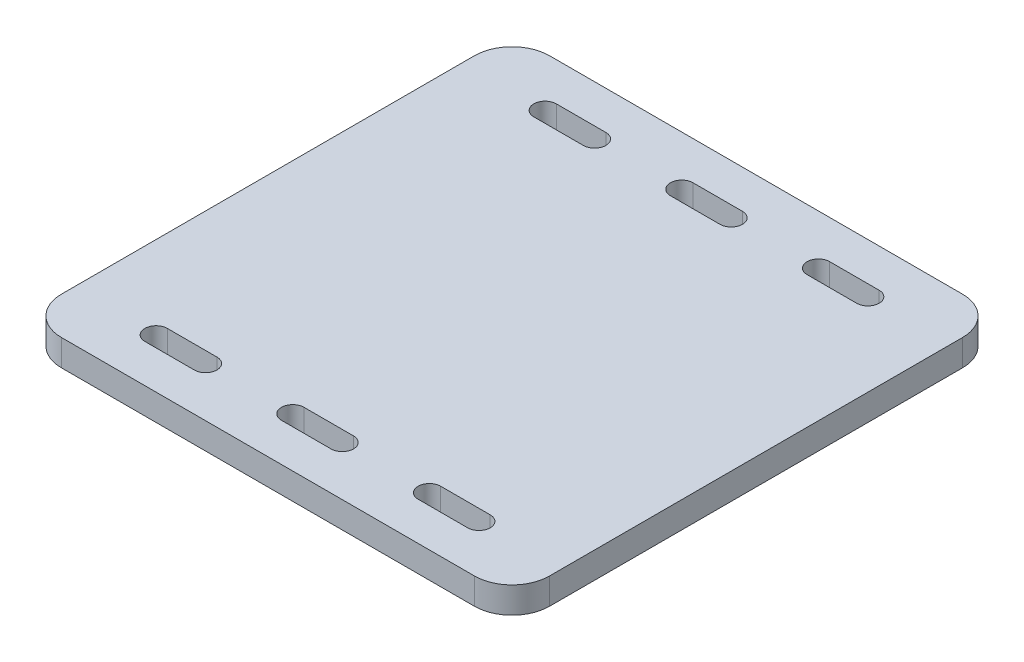
ISO-10303-21;
HEADER;
FILE_DESCRIPTION(('STEP AP214'),'2;1');
FILE_NAME('part.step','',(''),(''),'','','');
FILE_SCHEMA(('AUTOMOTIVE_DESIGN { 1 0 10303 214 1 1 1 1 }'));
ENDSEC;
DATA;
#1=APPLICATION_CONTEXT('core data for automotive mechanical design processes');
#2=APPLICATION_PROTOCOL_DEFINITION('international standard','automotive_design',2000,#1);
#3=PRODUCT_CONTEXT('',#1,'mechanical');
#4=PRODUCT('Part','Part','',(#3));
#5=PRODUCT_RELATED_PRODUCT_CATEGORY('part','',(#4));
#6=PRODUCT_DEFINITION_FORMATION('','',#4);
#7=PRODUCT_DEFINITION_CONTEXT('part definition',#1,'design');
#8=PRODUCT_DEFINITION('design','',#6,#7);
#9=PRODUCT_DEFINITION_SHAPE('','',#8);
#10=(LENGTH_UNIT() NAMED_UNIT(*) SI_UNIT(.MILLI.,.METRE.));
#11=(NAMED_UNIT(*) PLANE_ANGLE_UNIT() SI_UNIT($,.RADIAN.));
#12=(NAMED_UNIT(*) SI_UNIT($,.STERADIAN.) SOLID_ANGLE_UNIT());
#13=UNCERTAINTY_MEASURE_WITH_UNIT(LENGTH_MEASURE(1.E-05),#10,'distance_accuracy_value','');
#14=(GEOMETRIC_REPRESENTATION_CONTEXT(3) GLOBAL_UNCERTAINTY_ASSIGNED_CONTEXT((#13)) GLOBAL_UNIT_ASSIGNED_CONTEXT((#10,
#11,#12)) REPRESENTATION_CONTEXT('',''));
#15=CARTESIAN_POINT('',(0.,0.,0.));
#16=DIRECTION('',(0.,0.,1.));
#17=DIRECTION('',(1.,0.,0.));
#18=AXIS2_PLACEMENT_3D('',#15,#16,#17);
#19=CARTESIAN_POINT('',(-27.5,3.5,-27.5));
#20=DIRECTION('',(0.,1.,0.));
#21=DIRECTION('',(0.,0.,1.));
#22=AXIS2_PLACEMENT_3D('',#19,#20,#21);
#23=PLANE('',#22);
#24=CARTESIAN_POINT('',(-27.5,3.5,-27.5));
#25=DIRECTION('',(0.,1.,0.));
#26=DIRECTION('',(0.,0.,1.));
#27=AXIS2_PLACEMENT_3D('',#24,#25,#26);
#28=CIRCLE('',#27,5.);
#29=CARTESIAN_POINT('',(-27.5,3.5,-32.5));
#30=VERTEX_POINT('',#29);
#31=CARTESIAN_POINT('',(-32.5,3.5,-27.5));
#32=VERTEX_POINT('',#31);
#33=EDGE_CURVE('E517',#30,#32,#28,.T.);
#34=ORIENTED_EDGE('',*,*,#33,.T.);
#35=DIRECTION('',(0.,0.,1.));
#36=VECTOR('',#35,1.);
#37=CARTESIAN_POINT('',(-32.5,3.5,-27.5));
#38=LINE('',#37,#36);
#39=CARTESIAN_POINT('',(-32.5,3.5,27.5));
#40=VERTEX_POINT('',#39);
#41=EDGE_CURVE('E521',#32,#40,#38,.T.);
#42=ORIENTED_EDGE('',*,*,#41,.T.);
#43=CARTESIAN_POINT('',(-27.5,3.5,27.5));
#44=DIRECTION('',(0.,1.,0.));
#45=DIRECTION('',(0.,0.,1.));
#46=AXIS2_PLACEMENT_3D('',#43,#44,#45);
#47=CIRCLE('',#46,5.);
#48=CARTESIAN_POINT('',(-27.5,3.5,32.5));
#49=VERTEX_POINT('',#48);
#50=EDGE_CURVE('E525',#40,#49,#47,.T.);
#51=ORIENTED_EDGE('',*,*,#50,.T.);
#52=DIRECTION('',(1.,0.,0.));
#53=VECTOR('',#52,1.);
#54=CARTESIAN_POINT('',(-27.5,3.5,32.5));
#55=LINE('',#54,#53);
#56=CARTESIAN_POINT('',(27.5,3.5,32.5));
#57=VERTEX_POINT('',#56);
#58=EDGE_CURVE('E528',#49,#57,#55,.T.);
#59=ORIENTED_EDGE('',*,*,#58,.T.);
#60=CARTESIAN_POINT('',(27.5,3.5,27.5));
#61=DIRECTION('',(0.,1.,0.));
#62=DIRECTION('',(0.,0.,1.));
#63=AXIS2_PLACEMENT_3D('',#60,#61,#62);
#64=CIRCLE('',#63,5.);
#65=CARTESIAN_POINT('',(32.5,3.5,27.5));
#66=VERTEX_POINT('',#65);
#67=EDGE_CURVE('E531',#57,#66,#64,.T.);
#68=ORIENTED_EDGE('',*,*,#67,.T.);
#69=DIRECTION('',(0.,0.,-1.));
#70=VECTOR('',#69,1.);
#71=CARTESIAN_POINT('',(32.5,3.5,-27.5));
#72=LINE('',#71,#70);
#73=CARTESIAN_POINT('',(32.5,3.5,-27.5));
#74=VERTEX_POINT('',#73);
#75=EDGE_CURVE('E534',#66,#74,#72,.T.);
#76=ORIENTED_EDGE('',*,*,#75,.T.);
#77=CARTESIAN_POINT('',(27.5,3.5,-27.5));
#78=DIRECTION('',(0.,1.,0.));
#79=DIRECTION('',(0.,0.,-1.));
#80=AXIS2_PLACEMENT_3D('',#77,#78,#79);
#81=CIRCLE('',#80,5.);
#82=CARTESIAN_POINT('',(27.5,3.5,-32.5));
#83=VERTEX_POINT('',#82);
#84=EDGE_CURVE('E537',#74,#83,#81,.T.);
#85=ORIENTED_EDGE('',*,*,#84,.T.);
#86=DIRECTION('',(-1.,0.,0.));
#87=VECTOR('',#86,1.);
#88=CARTESIAN_POINT('',(-27.5,3.5,-32.5));
#89=LINE('',#88,#87);
#90=EDGE_CURVE('E540',#83,#30,#89,.T.);
#91=ORIENTED_EDGE('',*,*,#90,.T.);
#92=EDGE_LOOP('',(#34,#42,#51,#59,#68,#76,#85,#91));
#93=FACE_BOUND('',#92,.T.);
#94=DIRECTION('',(1.,0.,0.));
#95=VECTOR('',#94,1.);
#96=CARTESIAN_POINT('',(-21.5,3.5,27.4));
#97=LINE('',#96,#95);
#98=CARTESIAN_POINT('',(-21.5,3.5,27.4));
#99=VERTEX_POINT('',#98);
#100=CARTESIAN_POINT('',(-14.9,3.5,27.4));
#101=VERTEX_POINT('',#100);
#102=EDGE_CURVE('E477',#99,#101,#97,.T.);
#103=ORIENTED_EDGE('',*,*,#102,.F.);
#104=CARTESIAN_POINT('',(-21.5,3.5,25.9));
#105=DIRECTION('',(0.,1.,0.));
#106=DIRECTION('',(0.,0.,1.));
#107=AXIS2_PLACEMENT_3D('',#104,#105,#106);
#108=CIRCLE('',#107,1.5);
#109=CARTESIAN_POINT('',(-21.5,3.5,24.4));
#110=VERTEX_POINT('',#109);
#111=EDGE_CURVE('E474',#110,#99,#108,.T.);
#112=ORIENTED_EDGE('',*,*,#111,.F.);
#113=DIRECTION('',(-1.,0.,0.));
#114=VECTOR('',#113,1.);
#115=CARTESIAN_POINT('',(-21.5,3.5,24.4));
#116=LINE('',#115,#114);
#117=CARTESIAN_POINT('',(-14.9,3.5,24.4));
#118=VERTEX_POINT('',#117);
#119=EDGE_CURVE('E485',#118,#110,#116,.T.);
#120=ORIENTED_EDGE('',*,*,#119,.F.);
#121=CARTESIAN_POINT('',(-14.9,3.5,25.9));
#122=DIRECTION('',(0.,1.,0.));
#123=DIRECTION('',(0.,0.,1.));
#124=AXIS2_PLACEMENT_3D('',#121,#122,#123);
#125=CIRCLE('',#124,1.5);
#126=EDGE_CURVE('E481',#101,#118,#125,.T.);
#127=ORIENTED_EDGE('',*,*,#126,.F.);
#128=EDGE_LOOP('',(#103,#112,#120,#127));
#129=FACE_BOUND('',#128,.T.);
#130=DIRECTION('',(-1.,0.,0.));
#131=VECTOR('',#130,1.);
#132=CARTESIAN_POINT('',(21.5,3.5,24.4));
#133=LINE('',#132,#131);
#134=CARTESIAN_POINT('',(21.5,3.5,24.4));
#135=VERTEX_POINT('',#134);
#136=CARTESIAN_POINT('',(14.9,3.5,24.4));
#137=VERTEX_POINT('',#136);
#138=EDGE_CURVE('E434',#135,#137,#133,.T.);
#139=ORIENTED_EDGE('',*,*,#138,.F.);
#140=CARTESIAN_POINT('',(21.5,3.5,25.9));
#141=DIRECTION('',(0.,1.,0.));
#142=DIRECTION('',(0.,0.,-1.));
#143=AXIS2_PLACEMENT_3D('',#140,#141,#142);
#144=CIRCLE('',#143,1.5);
#145=CARTESIAN_POINT('',(21.5,3.5,27.4));
#146=VERTEX_POINT('',#145);
#147=EDGE_CURVE('E431',#146,#135,#144,.T.);
#148=ORIENTED_EDGE('',*,*,#147,.F.);
#149=DIRECTION('',(1.,0.,0.));
#150=VECTOR('',#149,1.);
#151=CARTESIAN_POINT('',(21.5,3.5,27.4));
#152=LINE('',#151,#150);
#153=CARTESIAN_POINT('',(14.9,3.5,27.4));
#154=VERTEX_POINT('',#153);
#155=EDGE_CURVE('E442',#154,#146,#152,.T.);
#156=ORIENTED_EDGE('',*,*,#155,.F.);
#157=CARTESIAN_POINT('',(14.9,3.5,25.9));
#158=DIRECTION('',(0.,1.,0.));
#159=DIRECTION('',(0.,0.,-1.));
#160=AXIS2_PLACEMENT_3D('',#157,#158,#159);
#161=CIRCLE('',#160,1.5);
#162=EDGE_CURVE('E438',#137,#154,#161,.T.);
#163=ORIENTED_EDGE('',*,*,#162,.F.);
#164=EDGE_LOOP('',(#139,#148,#156,#163));
#165=FACE_BOUND('',#164,.T.);
#166=DIRECTION('',(-1.,0.,0.));
#167=VECTOR('',#166,1.);
#168=CARTESIAN_POINT('',(21.5,3.5,-27.4));
#169=LINE('',#168,#167);
#170=CARTESIAN_POINT('',(21.5,3.5,-27.4));
#171=VERTEX_POINT('',#170);
#172=CARTESIAN_POINT('',(14.9,3.5,-27.4));
#173=VERTEX_POINT('',#172);
#174=EDGE_CURVE('E391',#171,#173,#169,.T.);
#175=ORIENTED_EDGE('',*,*,#174,.F.);
#176=CARTESIAN_POINT('',(21.5,3.5,-25.9));
#177=DIRECTION('',(0.,1.,0.));
#178=DIRECTION('',(0.,0.,1.));
#179=AXIS2_PLACEMENT_3D('',#176,#177,#178);
#180=CIRCLE('',#179,1.5);
#181=CARTESIAN_POINT('',(21.5,3.5,-24.4));
#182=VERTEX_POINT('',#181);
#183=EDGE_CURVE('E388',#182,#171,#180,.T.);
#184=ORIENTED_EDGE('',*,*,#183,.F.);
#185=DIRECTION('',(1.,0.,0.));
#186=VECTOR('',#185,1.);
#187=CARTESIAN_POINT('',(21.5,3.5,-24.4));
#188=LINE('',#187,#186);
#189=CARTESIAN_POINT('',(14.9,3.5,-24.4));
#190=VERTEX_POINT('',#189);
#191=EDGE_CURVE('E399',#190,#182,#188,.T.);
#192=ORIENTED_EDGE('',*,*,#191,.F.);
#193=CARTESIAN_POINT('',(14.9,3.5,-25.9));
#194=DIRECTION('',(0.,1.,0.));
#195=DIRECTION('',(0.,0.,1.));
#196=AXIS2_PLACEMENT_3D('',#193,#194,#195);
#197=CIRCLE('',#196,1.5);
#198=EDGE_CURVE('E395',#173,#190,#197,.T.);
#199=ORIENTED_EDGE('',*,*,#198,.F.);
#200=EDGE_LOOP('',(#175,#184,#192,#199));
#201=FACE_BOUND('',#200,.T.);
#202=DIRECTION('',(1.,0.,0.));
#203=VECTOR('',#202,1.);
#204=CARTESIAN_POINT('',(-21.5,3.5,-24.4));
#205=LINE('',#204,#203);
#206=CARTESIAN_POINT('',(-21.5,3.5,-24.4));
#207=VERTEX_POINT('',#206);
#208=CARTESIAN_POINT('',(-14.9,3.5,-24.4));
#209=VERTEX_POINT('',#208);
#210=EDGE_CURVE('E348',#207,#209,#205,.T.);
#211=ORIENTED_EDGE('',*,*,#210,.F.);
#212=CARTESIAN_POINT('',(-21.5,3.5,-25.9));
#213=DIRECTION('',(0.,1.,0.));
#214=DIRECTION('',(0.,0.,-1.));
#215=AXIS2_PLACEMENT_3D('',#212,#213,#214);
#216=CIRCLE('',#215,1.5);
#217=CARTESIAN_POINT('',(-21.5,3.5,-27.4));
#218=VERTEX_POINT('',#217);
#219=EDGE_CURVE('E345',#218,#207,#216,.T.);
#220=ORIENTED_EDGE('',*,*,#219,.F.);
#221=DIRECTION('',(-1.,0.,0.));
#222=VECTOR('',#221,1.);
#223=CARTESIAN_POINT('',(-21.5,3.5,-27.4));
#224=LINE('',#223,#222);
#225=CARTESIAN_POINT('',(-14.9,3.5,-27.4));
#226=VERTEX_POINT('',#225);
#227=EDGE_CURVE('E356',#226,#218,#224,.T.);
#228=ORIENTED_EDGE('',*,*,#227,.F.);
#229=CARTESIAN_POINT('',(-14.9,3.5,-25.9));
#230=DIRECTION('',(0.,1.,0.));
#231=DIRECTION('',(0.,0.,-1.));
#232=AXIS2_PLACEMENT_3D('',#229,#230,#231);
#233=CIRCLE('',#232,1.5);
#234=EDGE_CURVE('E352',#209,#226,#233,.T.);
#235=ORIENTED_EDGE('',*,*,#234,.F.);
#236=EDGE_LOOP('',(#211,#220,#228,#235));
#237=FACE_BOUND('',#236,.T.);
#238=DIRECTION('',(-1.,0.,0.));
#239=VECTOR('',#238,1.);
#240=CARTESIAN_POINT('',(-3.3,3.5,24.4));
#241=LINE('',#240,#239);
#242=CARTESIAN_POINT('',(3.3,3.5,24.4));
#243=VERTEX_POINT('',#242);
#244=CARTESIAN_POINT('',(-3.3,3.5,24.4));
#245=VERTEX_POINT('',#244);
#246=EDGE_CURVE('E305',#243,#245,#241,.T.);
#247=ORIENTED_EDGE('',*,*,#246,.F.);
#248=CARTESIAN_POINT('',(3.3,3.5,25.9));
#249=DIRECTION('',(0.,1.,0.));
#250=DIRECTION('',(0.,0.,1.));
#251=AXIS2_PLACEMENT_3D('',#248,#249,#250);
#252=CIRCLE('',#251,1.5);
#253=CARTESIAN_POINT('',(3.3,3.5,27.4));
#254=VERTEX_POINT('',#253);
#255=EDGE_CURVE('E302',#254,#243,#252,.T.);
#256=ORIENTED_EDGE('',*,*,#255,.F.);
#257=DIRECTION('',(1.,0.,0.));
#258=VECTOR('',#257,1.);
#259=CARTESIAN_POINT('',(-3.3,3.5,27.4));
#260=LINE('',#259,#258);
#261=CARTESIAN_POINT('',(-3.3,3.5,27.4));
#262=VERTEX_POINT('',#261);
#263=EDGE_CURVE('E313',#262,#254,#260,.T.);
#264=ORIENTED_EDGE('',*,*,#263,.F.);
#265=CARTESIAN_POINT('',(-3.3,3.5,25.9));
#266=DIRECTION('',(0.,1.,0.));
#267=DIRECTION('',(0.,0.,1.));
#268=AXIS2_PLACEMENT_3D('',#265,#266,#267);
#269=CIRCLE('',#268,1.5);
#270=EDGE_CURVE('E309',#245,#262,#269,.T.);
#271=ORIENTED_EDGE('',*,*,#270,.F.);
#272=EDGE_LOOP('',(#247,#256,#264,#271));
#273=FACE_BOUND('',#272,.T.);
#274=DIRECTION('',(1.,0.,0.));
#275=VECTOR('',#274,1.);
#276=CARTESIAN_POINT('',(-3.3,3.5,-24.4));
#277=LINE('',#276,#275);
#278=CARTESIAN_POINT('',(-3.3,3.5,-24.4));
#279=VERTEX_POINT('',#278);
#280=CARTESIAN_POINT('',(3.3,3.5,-24.4));
#281=VERTEX_POINT('',#280);
#282=EDGE_CURVE('E263',#279,#281,#277,.T.);
#283=ORIENTED_EDGE('',*,*,#282,.F.);
#284=CARTESIAN_POINT('',(-3.3,3.5,-25.9));
#285=DIRECTION('',(0.,1.,0.));
#286=DIRECTION('',(0.,0.,-1.));
#287=AXIS2_PLACEMENT_3D('',#284,#285,#286);
#288=CIRCLE('',#287,1.5);
#289=CARTESIAN_POINT('',(-3.3,3.5,-27.4));
#290=VERTEX_POINT('',#289);
#291=EDGE_CURVE('E254',#290,#279,#288,.T.);
#292=ORIENTED_EDGE('',*,*,#291,.F.);
#293=DIRECTION('',(-1.,0.,0.));
#294=VECTOR('',#293,1.);
#295=CARTESIAN_POINT('',(-3.3,3.5,-27.4));
#296=LINE('',#295,#294);
#297=CARTESIAN_POINT('',(3.3,3.5,-27.4));
#298=VERTEX_POINT('',#297);
#299=EDGE_CURVE('E280',#298,#290,#296,.T.);
#300=ORIENTED_EDGE('',*,*,#299,.F.);
#301=CARTESIAN_POINT('',(3.3,3.5,-25.9));
#302=DIRECTION('',(0.,1.,0.));
#303=DIRECTION('',(0.,0.,-1.));
#304=AXIS2_PLACEMENT_3D('',#301,#302,#303);
#305=CIRCLE('',#304,1.5);
#306=EDGE_CURVE('E276',#281,#298,#305,.T.);
#307=ORIENTED_EDGE('',*,*,#306,.F.);
#308=EDGE_LOOP('',(#283,#292,#300,#307));
#309=FACE_BOUND('',#308,.T.);
#310=ADVANCED_FACE('F44',(#93,#129,#165,#201,#237,#273,#309),#23,.T.);
#311=CARTESIAN_POINT('',(-27.5,0.,-27.5));
#312=DIRECTION('',(0.,1.,0.));
#313=DIRECTION('',(0.,0.,1.));
#314=AXIS2_PLACEMENT_3D('',#311,#312,#313);
#315=PLANE('',#314);
#316=CARTESIAN_POINT('',(3.3,0.,25.9));
#317=DIRECTION('',(0.,1.,0.));
#318=DIRECTION('',(0.,0.,1.));
#319=AXIS2_PLACEMENT_3D('',#316,#317,#318);
#320=CIRCLE('',#319,1.5);
#321=CARTESIAN_POINT('',(3.3,0.,27.4));
#322=VERTEX_POINT('',#321);
#323=CARTESIAN_POINT('',(3.3,0.,24.4));
#324=VERTEX_POINT('',#323);
#325=EDGE_CURVE('E272',#322,#324,#320,.T.);
#326=ORIENTED_EDGE('',*,*,#325,.T.);
#327=DIRECTION('',(-1.,0.,0.));
#328=VECTOR('',#327,1.);
#329=CARTESIAN_POINT('',(-3.3,0.,24.4));
#330=LINE('',#329,#328);
#331=CARTESIAN_POINT('',(-3.3,0.,24.4));
#332=VERTEX_POINT('',#331);
#333=EDGE_CURVE('E320',#324,#332,#330,.T.);
#334=ORIENTED_EDGE('',*,*,#333,.T.);
#335=CARTESIAN_POINT('',(-3.3,0.,25.9));
#336=DIRECTION('',(0.,1.,0.));
#337=DIRECTION('',(0.,0.,1.));
#338=AXIS2_PLACEMENT_3D('',#335,#336,#337);
#339=CIRCLE('',#338,1.5);
#340=CARTESIAN_POINT('',(-3.3,0.,27.4));
#341=VERTEX_POINT('',#340);
#342=EDGE_CURVE('E324',#332,#341,#339,.T.);
#343=ORIENTED_EDGE('',*,*,#342,.T.);
#344=DIRECTION('',(1.,0.,0.));
#345=VECTOR('',#344,1.);
#346=CARTESIAN_POINT('',(-3.3,0.,27.4));
#347=LINE('',#346,#345);
#348=EDGE_CURVE('E306',#341,#322,#347,.T.);
#349=ORIENTED_EDGE('',*,*,#348,.T.);
#350=EDGE_LOOP('',(#326,#334,#343,#349));
#351=FACE_BOUND('',#350,.T.);
#352=CARTESIAN_POINT('',(21.5,0.,-25.9));
#353=DIRECTION('',(0.,1.,0.));
#354=DIRECTION('',(0.,0.,1.));
#355=AXIS2_PLACEMENT_3D('',#352,#353,#354);
#356=CIRCLE('',#355,1.5);
#357=CARTESIAN_POINT('',(21.5,0.,-24.4));
#358=VERTEX_POINT('',#357);
#359=CARTESIAN_POINT('',(21.5,0.,-27.4));
#360=VERTEX_POINT('',#359);
#361=EDGE_CURVE('E387',#358,#360,#356,.T.);
#362=ORIENTED_EDGE('',*,*,#361,.T.);
#363=DIRECTION('',(-1.,0.,0.));
#364=VECTOR('',#363,1.);
#365=CARTESIAN_POINT('',(21.5,0.,-27.4));
#366=LINE('',#365,#364);
#367=CARTESIAN_POINT('',(14.9,0.,-27.4));
#368=VERTEX_POINT('',#367);
#369=EDGE_CURVE('E406',#360,#368,#366,.T.);
#370=ORIENTED_EDGE('',*,*,#369,.T.);
#371=CARTESIAN_POINT('',(14.9,0.,-25.9));
#372=DIRECTION('',(0.,1.,0.));
#373=DIRECTION('',(0.,0.,1.));
#374=AXIS2_PLACEMENT_3D('',#371,#372,#373);
#375=CIRCLE('',#374,1.5);
#376=CARTESIAN_POINT('',(14.9,0.,-24.4));
#377=VERTEX_POINT('',#376);
#378=EDGE_CURVE('E410',#368,#377,#375,.T.);
#379=ORIENTED_EDGE('',*,*,#378,.T.);
#380=DIRECTION('',(1.,0.,0.));
#381=VECTOR('',#380,1.);
#382=CARTESIAN_POINT('',(21.5,0.,-24.4));
#383=LINE('',#382,#381);
#384=EDGE_CURVE('E392',#377,#358,#383,.T.);
#385=ORIENTED_EDGE('',*,*,#384,.T.);
#386=EDGE_LOOP('',(#362,#370,#379,#385));
#387=FACE_BOUND('',#386,.T.);
#388=CARTESIAN_POINT('',(-21.5,0.,25.9));
#389=DIRECTION('',(0.,1.,0.));
#390=DIRECTION('',(0.,0.,1.));
#391=AXIS2_PLACEMENT_3D('',#388,#389,#390);
#392=CIRCLE('',#391,1.5);
#393=CARTESIAN_POINT('',(-21.5,0.,24.4));
#394=VERTEX_POINT('',#393);
#395=CARTESIAN_POINT('',(-21.5,0.,27.4));
#396=VERTEX_POINT('',#395);
#397=EDGE_CURVE('E473',#394,#396,#392,.T.);
#398=ORIENTED_EDGE('',*,*,#397,.T.);
#399=DIRECTION('',(1.,0.,0.));
#400=VECTOR('',#399,1.);
#401=CARTESIAN_POINT('',(-21.5,0.,27.4));
#402=LINE('',#401,#400);
#403=CARTESIAN_POINT('',(-14.9,0.,27.4));
#404=VERTEX_POINT('',#403);
#405=EDGE_CURVE('E492',#396,#404,#402,.T.);
#406=ORIENTED_EDGE('',*,*,#405,.T.);
#407=CARTESIAN_POINT('',(-14.9,0.,25.9));
#408=DIRECTION('',(0.,1.,0.));
#409=DIRECTION('',(0.,0.,1.));
#410=AXIS2_PLACEMENT_3D('',#407,#408,#409);
#411=CIRCLE('',#410,1.5);
#412=CARTESIAN_POINT('',(-14.9,0.,24.4));
#413=VERTEX_POINT('',#412);
#414=EDGE_CURVE('E496',#404,#413,#411,.T.);
#415=ORIENTED_EDGE('',*,*,#414,.T.);
#416=DIRECTION('',(-1.,0.,0.));
#417=VECTOR('',#416,1.);
#418=CARTESIAN_POINT('',(-21.5,0.,24.4));
#419=LINE('',#418,#417);
#420=EDGE_CURVE('E478',#413,#394,#419,.T.);
#421=ORIENTED_EDGE('',*,*,#420,.T.);
#422=EDGE_LOOP('',(#398,#406,#415,#421));
#423=FACE_BOUND('',#422,.T.);
#424=CARTESIAN_POINT('',(-27.5,0.,-27.5));
#425=DIRECTION('',(0.,1.,0.));
#426=DIRECTION('',(0.,0.,1.));
#427=AXIS2_PLACEMENT_3D('',#424,#425,#426);
#428=CIRCLE('',#427,5.);
#429=CARTESIAN_POINT('',(-27.5,0.,-32.5));
#430=VERTEX_POINT('',#429);
#431=CARTESIAN_POINT('',(-32.5,0.,-27.5));
#432=VERTEX_POINT('',#431);
#433=EDGE_CURVE('E516',#430,#432,#428,.T.);
#434=ORIENTED_EDGE('',*,*,#433,.F.);
#435=DIRECTION('',(-1.,0.,0.));
#436=VECTOR('',#435,1.);
#437=CARTESIAN_POINT('',(-27.5,0.,-32.5));
#438=LINE('',#437,#436);
#439=CARTESIAN_POINT('',(27.5,0.,-32.5));
#440=VERTEX_POINT('',#439);
#441=EDGE_CURVE('E522',#440,#430,#438,.T.);
#442=ORIENTED_EDGE('',*,*,#441,.F.);
#443=CARTESIAN_POINT('',(27.5,0.,-27.5));
#444=DIRECTION('',(0.,1.,0.));
#445=DIRECTION('',(0.,0.,-1.));
#446=AXIS2_PLACEMENT_3D('',#443,#444,#445);
#447=CIRCLE('',#446,5.);
#448=CARTESIAN_POINT('',(32.5,0.,-27.5));
#449=VERTEX_POINT('',#448);
#450=EDGE_CURVE('E562',#449,#440,#447,.T.);
#451=ORIENTED_EDGE('',*,*,#450,.F.);
#452=DIRECTION('',(0.,0.,-1.));
#453=VECTOR('',#452,1.);
#454=CARTESIAN_POINT('',(32.5,0.,-27.5));
#455=LINE('',#454,#453);
#456=CARTESIAN_POINT('',(32.5,0.,27.5));
#457=VERTEX_POINT('',#456);
#458=EDGE_CURVE('E559',#457,#449,#455,.T.);
#459=ORIENTED_EDGE('',*,*,#458,.F.);
#460=CARTESIAN_POINT('',(27.5,0.,27.5));
#461=DIRECTION('',(0.,1.,0.));
#462=DIRECTION('',(0.,0.,1.));
#463=AXIS2_PLACEMENT_3D('',#460,#461,#462);
#464=CIRCLE('',#463,5.);
#465=CARTESIAN_POINT('',(27.5,0.,32.5));
#466=VERTEX_POINT('',#465);
#467=EDGE_CURVE('E556',#466,#457,#464,.T.);
#468=ORIENTED_EDGE('',*,*,#467,.F.);
#469=DIRECTION('',(1.,0.,0.));
#470=VECTOR('',#469,1.);
#471=CARTESIAN_POINT('',(-27.5,0.,32.5));
#472=LINE('',#471,#470);
#473=CARTESIAN_POINT('',(-27.5,0.,32.5));
#474=VERTEX_POINT('',#473);
#475=EDGE_CURVE('E553',#474,#466,#472,.T.);
#476=ORIENTED_EDGE('',*,*,#475,.F.);
#477=CARTESIAN_POINT('',(-27.5,0.,27.5));
#478=DIRECTION('',(0.,1.,0.));
#479=DIRECTION('',(0.,0.,1.));
#480=AXIS2_PLACEMENT_3D('',#477,#478,#479);
#481=CIRCLE('',#480,5.);
#482=CARTESIAN_POINT('',(-32.5,0.,27.5));
#483=VERTEX_POINT('',#482);
#484=EDGE_CURVE('E550',#483,#474,#481,.T.);
#485=ORIENTED_EDGE('',*,*,#484,.F.);
#486=DIRECTION('',(0.,0.,1.));
#487=VECTOR('',#486,1.);
#488=CARTESIAN_POINT('',(-32.5,0.,-27.5));
#489=LINE('',#488,#487);
#490=EDGE_CURVE('E547',#432,#483,#489,.T.);
#491=ORIENTED_EDGE('',*,*,#490,.F.);
#492=EDGE_LOOP('',(#434,#442,#451,#459,#468,#476,#485,#491));
#493=FACE_BOUND('',#492,.T.);
#494=CARTESIAN_POINT('',(21.5,0.,25.9));
#495=DIRECTION('',(0.,1.,0.));
#496=DIRECTION('',(0.,0.,-1.));
#497=AXIS2_PLACEMENT_3D('',#494,#495,#496);
#498=CIRCLE('',#497,1.5);
#499=CARTESIAN_POINT('',(21.5,0.,27.4));
#500=VERTEX_POINT('',#499);
#501=CARTESIAN_POINT('',(21.5,0.,24.4));
#502=VERTEX_POINT('',#501);
#503=EDGE_CURVE('E430',#500,#502,#498,.T.);
#504=ORIENTED_EDGE('',*,*,#503,.T.);
#505=DIRECTION('',(-1.,0.,0.));
#506=VECTOR('',#505,1.);
#507=CARTESIAN_POINT('',(21.5,0.,24.4));
#508=LINE('',#507,#506);
#509=CARTESIAN_POINT('',(14.9,0.,24.4));
#510=VERTEX_POINT('',#509);
#511=EDGE_CURVE('E449',#502,#510,#508,.T.);
#512=ORIENTED_EDGE('',*,*,#511,.T.);
#513=CARTESIAN_POINT('',(14.9,0.,25.9));
#514=DIRECTION('',(0.,1.,0.));
#515=DIRECTION('',(0.,0.,-1.));
#516=AXIS2_PLACEMENT_3D('',#513,#514,#515);
#517=CIRCLE('',#516,1.5);
#518=CARTESIAN_POINT('',(14.9,0.,27.4));
#519=VERTEX_POINT('',#518);
#520=EDGE_CURVE('E453',#510,#519,#517,.T.);
#521=ORIENTED_EDGE('',*,*,#520,.T.);
#522=DIRECTION('',(1.,0.,0.));
#523=VECTOR('',#522,1.);
#524=CARTESIAN_POINT('',(21.5,0.,27.4));
#525=LINE('',#524,#523);
#526=EDGE_CURVE('E435',#519,#500,#525,.T.);
#527=ORIENTED_EDGE('',*,*,#526,.T.);
#528=EDGE_LOOP('',(#504,#512,#521,#527));
#529=FACE_BOUND('',#528,.T.);
#530=CARTESIAN_POINT('',(-21.5,0.,-25.9));
#531=DIRECTION('',(0.,1.,0.));
#532=DIRECTION('',(0.,0.,-1.));
#533=AXIS2_PLACEMENT_3D('',#530,#531,#532);
#534=CIRCLE('',#533,1.5);
#535=CARTESIAN_POINT('',(-21.5,0.,-27.4));
#536=VERTEX_POINT('',#535);
#537=CARTESIAN_POINT('',(-21.5,0.,-24.4));
#538=VERTEX_POINT('',#537);
#539=EDGE_CURVE('E344',#536,#538,#534,.T.);
#540=ORIENTED_EDGE('',*,*,#539,.T.);
#541=DIRECTION('',(1.,0.,0.));
#542=VECTOR('',#541,1.);
#543=CARTESIAN_POINT('',(-21.5,0.,-24.4));
#544=LINE('',#543,#542);
#545=CARTESIAN_POINT('',(-14.9,0.,-24.4));
#546=VERTEX_POINT('',#545);
#547=EDGE_CURVE('E363',#538,#546,#544,.T.);
#548=ORIENTED_EDGE('',*,*,#547,.T.);
#549=CARTESIAN_POINT('',(-14.9,0.,-25.9));
#550=DIRECTION('',(0.,1.,0.));
#551=DIRECTION('',(0.,0.,-1.));
#552=AXIS2_PLACEMENT_3D('',#549,#550,#551);
#553=CIRCLE('',#552,1.5);
#554=CARTESIAN_POINT('',(-14.9,0.,-27.4));
#555=VERTEX_POINT('',#554);
#556=EDGE_CURVE('E367',#546,#555,#553,.T.);
#557=ORIENTED_EDGE('',*,*,#556,.T.);
#558=DIRECTION('',(-1.,0.,0.));
#559=VECTOR('',#558,1.);
#560=CARTESIAN_POINT('',(-21.5,0.,-27.4));
#561=LINE('',#560,#559);
#562=EDGE_CURVE('E349',#555,#536,#561,.T.);
#563=ORIENTED_EDGE('',*,*,#562,.T.);
#564=EDGE_LOOP('',(#540,#548,#557,#563));
#565=FACE_BOUND('',#564,.T.);
#566=CARTESIAN_POINT('',(-3.3,0.,-25.9));
#567=DIRECTION('',(0.,1.,0.));
#568=DIRECTION('',(0.,0.,-1.));
#569=AXIS2_PLACEMENT_3D('',#566,#567,#568);
#570=CIRCLE('',#569,1.5);
#571=CARTESIAN_POINT('',(-3.3,0.,-27.4));
#572=VERTEX_POINT('',#571);
#573=CARTESIAN_POINT('',(-3.3,0.,-24.4));
#574=VERTEX_POINT('',#573);
#575=EDGE_CURVE('E68',#572,#574,#570,.T.);
#576=ORIENTED_EDGE('',*,*,#575,.T.);
#577=DIRECTION('',(1.,0.,0.));
#578=VECTOR('',#577,1.);
#579=CARTESIAN_POINT('',(-3.3,0.,-24.4));
#580=LINE('',#579,#578);
#581=CARTESIAN_POINT('',(3.3,0.,-24.4));
#582=VERTEX_POINT('',#581);
#583=EDGE_CURVE('E270',#574,#582,#580,.T.);
#584=ORIENTED_EDGE('',*,*,#583,.T.);
#585=CARTESIAN_POINT('',(3.3,0.,-25.9));
#586=DIRECTION('',(0.,1.,0.));
#587=DIRECTION('',(0.,0.,-1.));
#588=AXIS2_PLACEMENT_3D('',#585,#586,#587);
#589=CIRCLE('',#588,1.5);
#590=CARTESIAN_POINT('',(3.3,0.,-27.4));
#591=VERTEX_POINT('',#590);
#592=EDGE_CURVE('E289',#582,#591,#589,.T.);
#593=ORIENTED_EDGE('',*,*,#592,.T.);
#594=DIRECTION('',(-1.,0.,0.));
#595=VECTOR('',#594,1.);
#596=CARTESIAN_POINT('',(-3.3,0.,-27.4));
#597=LINE('',#596,#595);
#598=EDGE_CURVE('E264',#591,#572,#597,.T.);
#599=ORIENTED_EDGE('',*,*,#598,.T.);
#600=EDGE_LOOP('',(#576,#584,#593,#599));
#601=FACE_BOUND('',#600,.T.);
#602=ADVANCED_FACE('F601',(#351,#387,#423,#493,#529,#565,#601),#315,.F.);
#603=CARTESIAN_POINT('',(-27.5,3.5,-27.5));
#604=DIRECTION('',(0.,-1.,0.));
#605=DIRECTION('',(0.,0.,-1.));
#606=AXIS2_PLACEMENT_3D('',#603,#604,#605);
#607=CYLINDRICAL_SURFACE('',#606,5.);
#608=ORIENTED_EDGE('',*,*,#433,.T.);
#609=DIRECTION('',(0.,-1.,0.));
#610=VECTOR('',#609,1.);
#611=CARTESIAN_POINT('',(-32.5,3.5,-27.5));
#612=LINE('',#611,#610);
#613=EDGE_CURVE('E11',#32,#432,#612,.T.);
#614=ORIENTED_EDGE('',*,*,#613,.F.);
#615=ORIENTED_EDGE('',*,*,#33,.F.);
#616=DIRECTION('',(0.,-1.,0.));
#617=VECTOR('',#616,1.);
#618=CARTESIAN_POINT('',(-27.5,3.5,-32.5));
#619=LINE('',#618,#617);
#620=EDGE_CURVE('E543',#30,#430,#619,.T.);
#621=ORIENTED_EDGE('',*,*,#620,.T.);
#622=EDGE_LOOP('',(#608,#614,#615,#621));
#623=FACE_BOUND('',#622,.T.);
#624=ADVANCED_FACE('F46',(#623),#607,.T.);
#625=CARTESIAN_POINT('',(-32.5,3.5,-27.5));
#626=DIRECTION('',(1.,0.,0.));
#627=DIRECTION('',(0.,0.,-1.));
#628=AXIS2_PLACEMENT_3D('',#625,#626,#627);
#629=PLANE('',#628);
#630=ORIENTED_EDGE('',*,*,#490,.T.);
#631=DIRECTION('',(0.,-1.,0.));
#632=VECTOR('',#631,1.);
#633=CARTESIAN_POINT('',(-32.5,3.5,27.5));
#634=LINE('',#633,#632);
#635=EDGE_CURVE('E53',#40,#483,#634,.T.);
#636=ORIENTED_EDGE('',*,*,#635,.F.);
#637=ORIENTED_EDGE('',*,*,#41,.F.);
#638=ORIENTED_EDGE('',*,*,#613,.T.);
#639=EDGE_LOOP('',(#630,#636,#637,#638));
#640=FACE_BOUND('',#639,.T.);
#641=ADVANCED_FACE('F619',(#640),#629,.F.);
#642=CARTESIAN_POINT('',(-27.5,3.5,27.5));
#643=DIRECTION('',(0.,-1.,0.));
#644=DIRECTION('',(0.,0.,-1.));
#645=AXIS2_PLACEMENT_3D('',#642,#643,#644);
#646=CYLINDRICAL_SURFACE('',#645,5.);
#647=ORIENTED_EDGE('',*,*,#484,.T.);
#648=DIRECTION('',(0.,-1.,0.));
#649=VECTOR('',#648,1.);
#650=CARTESIAN_POINT('',(-27.5,3.5,32.5));
#651=LINE('',#650,#649);
#652=EDGE_CURVE('E586',#49,#474,#651,.T.);
#653=ORIENTED_EDGE('',*,*,#652,.F.);
#654=ORIENTED_EDGE('',*,*,#50,.F.);
#655=ORIENTED_EDGE('',*,*,#635,.T.);
#656=EDGE_LOOP('',(#647,#653,#654,#655));
#657=FACE_BOUND('',#656,.T.);
#658=ADVANCED_FACE('F595',(#657),#646,.T.);
#659=CARTESIAN_POINT('',(-27.5,3.5,32.5));
#660=DIRECTION('',(0.,0.,-1.));
#661=DIRECTION('',(-1.,0.,0.));
#662=AXIS2_PLACEMENT_3D('',#659,#660,#661);
#663=PLANE('',#662);
#664=ORIENTED_EDGE('',*,*,#475,.T.);
#665=DIRECTION('',(0.,-1.,0.));
#666=VECTOR('',#665,1.);
#667=CARTESIAN_POINT('',(27.5,3.5,32.5));
#668=LINE('',#667,#666);
#669=EDGE_CURVE('E582',#57,#466,#668,.T.);
#670=ORIENTED_EDGE('',*,*,#669,.F.);
#671=ORIENTED_EDGE('',*,*,#58,.F.);
#672=ORIENTED_EDGE('',*,*,#652,.T.);
#673=EDGE_LOOP('',(#664,#670,#671,#672));
#674=FACE_BOUND('',#673,.T.);
#675=ADVANCED_FACE('F607',(#674),#663,.F.);
#676=CARTESIAN_POINT('',(27.5,3.5,27.5));
#677=DIRECTION('',(0.,-1.,0.));
#678=DIRECTION('',(0.,0.,-1.));
#679=AXIS2_PLACEMENT_3D('',#676,#677,#678);
#680=CYLINDRICAL_SURFACE('',#679,5.);
#681=ORIENTED_EDGE('',*,*,#467,.T.);
#682=DIRECTION('',(0.,-1.,0.));
#683=VECTOR('',#682,1.);
#684=CARTESIAN_POINT('',(32.5,3.5,27.5));
#685=LINE('',#684,#683);
#686=EDGE_CURVE('E578',#66,#457,#685,.T.);
#687=ORIENTED_EDGE('',*,*,#686,.F.);
#688=ORIENTED_EDGE('',*,*,#67,.F.);
#689=ORIENTED_EDGE('',*,*,#669,.T.);
#690=EDGE_LOOP('',(#681,#687,#688,#689));
#691=FACE_BOUND('',#690,.T.);
#692=ADVANCED_FACE('F611',(#691),#680,.T.);
#693=CARTESIAN_POINT('',(32.5,3.5,-27.5));
#694=DIRECTION('',(-1.,0.,0.));
#695=DIRECTION('',(0.,0.,1.));
#696=AXIS2_PLACEMENT_3D('',#693,#694,#695);
#697=PLANE('',#696);
#698=ORIENTED_EDGE('',*,*,#458,.T.);
#699=DIRECTION('',(0.,-1.,0.));
#700=VECTOR('',#699,1.);
#701=CARTESIAN_POINT('',(32.5,3.5,-27.5));
#702=LINE('',#701,#700);
#703=EDGE_CURVE('E574',#74,#449,#702,.T.);
#704=ORIENTED_EDGE('',*,*,#703,.F.);
#705=ORIENTED_EDGE('',*,*,#75,.F.);
#706=ORIENTED_EDGE('',*,*,#686,.T.);
#707=EDGE_LOOP('',(#698,#704,#705,#706));
#708=FACE_BOUND('',#707,.T.);
#709=ADVANCED_FACE('F632',(#708),#697,.F.);
#710=CARTESIAN_POINT('',(27.5,3.5,-27.5));
#711=DIRECTION('',(0.,-1.,0.));
#712=DIRECTION('',(0.,0.,-1.));
#713=AXIS2_PLACEMENT_3D('',#710,#711,#712);
#714=CYLINDRICAL_SURFACE('',#713,5.);
#715=ORIENTED_EDGE('',*,*,#450,.T.);
#716=DIRECTION('',(0.,-1.,0.));
#717=VECTOR('',#716,1.);
#718=CARTESIAN_POINT('',(27.5,3.5,-32.5));
#719=LINE('',#718,#717);
#720=EDGE_CURVE('E570',#83,#440,#719,.T.);
#721=ORIENTED_EDGE('',*,*,#720,.F.);
#722=ORIENTED_EDGE('',*,*,#84,.F.);
#723=ORIENTED_EDGE('',*,*,#703,.T.);
#724=EDGE_LOOP('',(#715,#721,#722,#723));
#725=FACE_BOUND('',#724,.T.);
#726=ADVANCED_FACE('F630',(#725),#714,.T.);
#727=CARTESIAN_POINT('',(-27.5,3.5,-32.5));
#728=DIRECTION('',(0.,0.,1.));
#729=DIRECTION('',(1.,0.,0.));
#730=AXIS2_PLACEMENT_3D('',#727,#728,#729);
#731=PLANE('',#730);
#732=ORIENTED_EDGE('',*,*,#441,.T.);
#733=ORIENTED_EDGE('',*,*,#620,.F.);
#734=ORIENTED_EDGE('',*,*,#90,.F.);
#735=ORIENTED_EDGE('',*,*,#720,.T.);
#736=EDGE_LOOP('',(#732,#733,#734,#735));
#737=FACE_BOUND('',#736,.T.);
#738=ADVANCED_FACE('F625',(#737),#731,.F.);
#739=CARTESIAN_POINT('',(-21.5,3.5,25.9));
#740=DIRECTION('',(0.,-1.,0.));
#741=DIRECTION('',(0.,0.,-1.));
#742=AXIS2_PLACEMENT_3D('',#739,#740,#741);
#743=CYLINDRICAL_SURFACE('',#742,1.5);
#744=ORIENTED_EDGE('',*,*,#397,.F.);
#745=DIRECTION('',(0.,-1.,0.));
#746=VECTOR('',#745,1.);
#747=CARTESIAN_POINT('',(-21.5,3.5,24.4));
#748=LINE('',#747,#746);
#749=EDGE_CURVE('E488',#110,#394,#748,.T.);
#750=ORIENTED_EDGE('',*,*,#749,.F.);
#751=ORIENTED_EDGE('',*,*,#111,.T.);
#752=DIRECTION('',(0.,-1.,0.));
#753=VECTOR('',#752,1.);
#754=CARTESIAN_POINT('',(-21.5,3.5,27.4));
#755=LINE('',#754,#753);
#756=EDGE_CURVE('E512',#99,#396,#755,.T.);
#757=ORIENTED_EDGE('',*,*,#756,.T.);
#758=EDGE_LOOP('',(#744,#750,#751,#757));
#759=FACE_BOUND('',#758,.T.);
#760=ADVANCED_FACE('F649',(#759),#743,.F.);
#761=CARTESIAN_POINT('',(-21.5,3.5,27.4));
#762=DIRECTION('',(0.,0.,-1.));
#763=DIRECTION('',(-1.,0.,0.));
#764=AXIS2_PLACEMENT_3D('',#761,#762,#763);
#765=PLANE('',#764);
#766=ORIENTED_EDGE('',*,*,#405,.F.);
#767=ORIENTED_EDGE('',*,*,#756,.F.);
#768=ORIENTED_EDGE('',*,*,#102,.T.);
#769=DIRECTION('',(0.,-1.,0.));
#770=VECTOR('',#769,1.);
#771=CARTESIAN_POINT('',(-14.9,3.5,27.4));
#772=LINE('',#771,#770);
#773=EDGE_CURVE('E509',#101,#404,#772,.T.);
#774=ORIENTED_EDGE('',*,*,#773,.T.);
#775=EDGE_LOOP('',(#766,#767,#768,#774));
#776=FACE_BOUND('',#775,.T.);
#777=ADVANCED_FACE('F656',(#776),#765,.T.);
#778=CARTESIAN_POINT('',(-14.9,3.5,25.9));
#779=DIRECTION('',(0.,-1.,0.));
#780=DIRECTION('',(0.,0.,-1.));
#781=AXIS2_PLACEMENT_3D('',#778,#779,#780);
#782=CYLINDRICAL_SURFACE('',#781,1.5);
#783=ORIENTED_EDGE('',*,*,#414,.F.);
#784=ORIENTED_EDGE('',*,*,#773,.F.);
#785=ORIENTED_EDGE('',*,*,#126,.T.);
#786=DIRECTION('',(0.,-1.,0.));
#787=VECTOR('',#786,1.);
#788=CARTESIAN_POINT('',(-14.9,3.5,24.4));
#789=LINE('',#788,#787);
#790=EDGE_CURVE('E506',#118,#413,#789,.T.);
#791=ORIENTED_EDGE('',*,*,#790,.T.);
#792=EDGE_LOOP('',(#783,#784,#785,#791));
#793=FACE_BOUND('',#792,.T.);
#794=ADVANCED_FACE('F661',(#793),#782,.F.);
#795=CARTESIAN_POINT('',(-21.5,3.5,24.4));
#796=DIRECTION('',(0.,0.,1.));
#797=DIRECTION('',(1.,0.,0.));
#798=AXIS2_PLACEMENT_3D('',#795,#796,#797);
#799=PLANE('',#798);
#800=ORIENTED_EDGE('',*,*,#420,.F.);
#801=ORIENTED_EDGE('',*,*,#790,.F.);
#802=ORIENTED_EDGE('',*,*,#119,.T.);
#803=ORIENTED_EDGE('',*,*,#749,.T.);
#804=EDGE_LOOP('',(#800,#801,#802,#803));
#805=FACE_BOUND('',#804,.T.);
#806=ADVANCED_FACE('F669',(#805),#799,.T.);
#807=CARTESIAN_POINT('',(21.5,3.5,25.9));
#808=DIRECTION('',(0.,-1.,0.));
#809=DIRECTION('',(0.,0.,-1.));
#810=AXIS2_PLACEMENT_3D('',#807,#808,#809);
#811=CYLINDRICAL_SURFACE('',#810,1.5);
#812=ORIENTED_EDGE('',*,*,#503,.F.);
#813=DIRECTION('',(0.,-1.,0.));
#814=VECTOR('',#813,1.);
#815=CARTESIAN_POINT('',(21.5,3.5,27.4));
#816=LINE('',#815,#814);
#817=EDGE_CURVE('E445',#146,#500,#816,.T.);
#818=ORIENTED_EDGE('',*,*,#817,.F.);
#819=ORIENTED_EDGE('',*,*,#147,.T.);
#820=DIRECTION('',(0.,-1.,0.));
#821=VECTOR('',#820,1.);
#822=CARTESIAN_POINT('',(21.5,3.5,24.4));
#823=LINE('',#822,#821);
#824=EDGE_CURVE('E469',#135,#502,#823,.T.);
#825=ORIENTED_EDGE('',*,*,#824,.T.);
#826=EDGE_LOOP('',(#812,#818,#819,#825));
#827=FACE_BOUND('',#826,.T.);
#828=ADVANCED_FACE('F764',(#827),#811,.F.);
#829=CARTESIAN_POINT('',(21.5,3.5,24.4));
#830=DIRECTION('',(0.,0.,1.));
#831=DIRECTION('',(1.,0.,0.));
#832=AXIS2_PLACEMENT_3D('',#829,#830,#831);
#833=PLANE('',#832);
#834=ORIENTED_EDGE('',*,*,#511,.F.);
#835=ORIENTED_EDGE('',*,*,#824,.F.);
#836=ORIENTED_EDGE('',*,*,#138,.T.);
#837=DIRECTION('',(0.,-1.,0.));
#838=VECTOR('',#837,1.);
#839=CARTESIAN_POINT('',(14.9,3.5,24.4));
#840=LINE('',#839,#838);
#841=EDGE_CURVE('E466',#137,#510,#840,.T.);
#842=ORIENTED_EDGE('',*,*,#841,.T.);
#843=EDGE_LOOP('',(#834,#835,#836,#842));
#844=FACE_BOUND('',#843,.T.);
#845=ADVANCED_FACE('F760',(#844),#833,.T.);
#846=CARTESIAN_POINT('',(14.9,3.5,25.9));
#847=DIRECTION('',(0.,-1.,0.));
#848=DIRECTION('',(0.,0.,-1.));
#849=AXIS2_PLACEMENT_3D('',#846,#847,#848);
#850=CYLINDRICAL_SURFACE('',#849,1.5);
#851=ORIENTED_EDGE('',*,*,#520,.F.);
#852=ORIENTED_EDGE('',*,*,#841,.F.);
#853=ORIENTED_EDGE('',*,*,#162,.T.);
#854=DIRECTION('',(0.,-1.,0.));
#855=VECTOR('',#854,1.);
#856=CARTESIAN_POINT('',(14.9,3.5,27.4));
#857=LINE('',#856,#855);
#858=EDGE_CURVE('E463',#154,#519,#857,.T.);
#859=ORIENTED_EDGE('',*,*,#858,.T.);
#860=EDGE_LOOP('',(#851,#852,#853,#859));
#861=FACE_BOUND('',#860,.T.);
#862=ADVANCED_FACE('F756',(#861),#850,.F.);
#863=CARTESIAN_POINT('',(21.5,3.5,27.4));
#864=DIRECTION('',(0.,0.,-1.));
#865=DIRECTION('',(-1.,0.,0.));
#866=AXIS2_PLACEMENT_3D('',#863,#864,#865);
#867=PLANE('',#866);
#868=ORIENTED_EDGE('',*,*,#526,.F.);
#869=ORIENTED_EDGE('',*,*,#858,.F.);
#870=ORIENTED_EDGE('',*,*,#155,.T.);
#871=ORIENTED_EDGE('',*,*,#817,.T.);
#872=EDGE_LOOP('',(#868,#869,#870,#871));
#873=FACE_BOUND('',#872,.T.);
#874=ADVANCED_FACE('F752',(#873),#867,.T.);
#875=CARTESIAN_POINT('',(21.5,3.5,-25.9));
#876=DIRECTION('',(0.,-1.,0.));
#877=DIRECTION('',(0.,0.,-1.));
#878=AXIS2_PLACEMENT_3D('',#875,#876,#877);
#879=CYLINDRICAL_SURFACE('',#878,1.5);
#880=ORIENTED_EDGE('',*,*,#361,.F.);
#881=DIRECTION('',(0.,-1.,0.));
#882=VECTOR('',#881,1.);
#883=CARTESIAN_POINT('',(21.5,3.5,-24.4));
#884=LINE('',#883,#882);
#885=EDGE_CURVE('E402',#182,#358,#884,.T.);
#886=ORIENTED_EDGE('',*,*,#885,.F.);
#887=ORIENTED_EDGE('',*,*,#183,.T.);
#888=DIRECTION('',(0.,-1.,0.));
#889=VECTOR('',#888,1.);
#890=CARTESIAN_POINT('',(21.5,3.5,-27.4));
#891=LINE('',#890,#889);
#892=EDGE_CURVE('E426',#171,#360,#891,.T.);
#893=ORIENTED_EDGE('',*,*,#892,.T.);
#894=EDGE_LOOP('',(#880,#886,#887,#893));
#895=FACE_BOUND('',#894,.T.);
#896=ADVANCED_FACE('F748',(#895),#879,.F.);
#897=CARTESIAN_POINT('',(21.5,3.5,-27.4));
#898=DIRECTION('',(0.,0.,1.));
#899=DIRECTION('',(1.,0.,0.));
#900=AXIS2_PLACEMENT_3D('',#897,#898,#899);
#901=PLANE('',#900);
#902=ORIENTED_EDGE('',*,*,#369,.F.);
#903=ORIENTED_EDGE('',*,*,#892,.F.);
#904=ORIENTED_EDGE('',*,*,#174,.T.);
#905=DIRECTION('',(0.,-1.,0.));
#906=VECTOR('',#905,1.);
#907=CARTESIAN_POINT('',(14.9,3.5,-27.4));
#908=LINE('',#907,#906);
#909=EDGE_CURVE('E423',#173,#368,#908,.T.);
#910=ORIENTED_EDGE('',*,*,#909,.T.);
#911=EDGE_LOOP('',(#902,#903,#904,#910));
#912=FACE_BOUND('',#911,.T.);
#913=ADVANCED_FACE('F744',(#912),#901,.T.);
#914=CARTESIAN_POINT('',(14.9,3.5,-25.9));
#915=DIRECTION('',(0.,-1.,0.));
#916=DIRECTION('',(0.,0.,-1.));
#917=AXIS2_PLACEMENT_3D('',#914,#915,#916);
#918=CYLINDRICAL_SURFACE('',#917,1.5);
#919=ORIENTED_EDGE('',*,*,#378,.F.);
#920=ORIENTED_EDGE('',*,*,#909,.F.);
#921=ORIENTED_EDGE('',*,*,#198,.T.);
#922=DIRECTION('',(0.,-1.,0.));
#923=VECTOR('',#922,1.);
#924=CARTESIAN_POINT('',(14.9,3.5,-24.4));
#925=LINE('',#924,#923);
#926=EDGE_CURVE('E420',#190,#377,#925,.T.);
#927=ORIENTED_EDGE('',*,*,#926,.T.);
#928=EDGE_LOOP('',(#919,#920,#921,#927));
#929=FACE_BOUND('',#928,.T.);
#930=ADVANCED_FACE('F740',(#929),#918,.F.);
#931=CARTESIAN_POINT('',(21.5,3.5,-24.4));
#932=DIRECTION('',(0.,0.,-1.));
#933=DIRECTION('',(-1.,0.,0.));
#934=AXIS2_PLACEMENT_3D('',#931,#932,#933);
#935=PLANE('',#934);
#936=ORIENTED_EDGE('',*,*,#384,.F.);
#937=ORIENTED_EDGE('',*,*,#926,.F.);
#938=ORIENTED_EDGE('',*,*,#191,.T.);
#939=ORIENTED_EDGE('',*,*,#885,.T.);
#940=EDGE_LOOP('',(#936,#937,#938,#939));
#941=FACE_BOUND('',#940,.T.);
#942=ADVANCED_FACE('F736',(#941),#935,.T.);
#943=CARTESIAN_POINT('',(-21.5,3.5,-25.9));
#944=DIRECTION('',(0.,-1.,0.));
#945=DIRECTION('',(0.,0.,-1.));
#946=AXIS2_PLACEMENT_3D('',#943,#944,#945);
#947=CYLINDRICAL_SURFACE('',#946,1.5);
#948=ORIENTED_EDGE('',*,*,#539,.F.);
#949=DIRECTION('',(0.,-1.,0.));
#950=VECTOR('',#949,1.);
#951=CARTESIAN_POINT('',(-21.5,3.5,-27.4));
#952=LINE('',#951,#950);
#953=EDGE_CURVE('E359',#218,#536,#952,.T.);
#954=ORIENTED_EDGE('',*,*,#953,.F.);
#955=ORIENTED_EDGE('',*,*,#219,.T.);
#956=DIRECTION('',(0.,-1.,0.));
#957=VECTOR('',#956,1.);
#958=CARTESIAN_POINT('',(-21.5,3.5,-24.4));
#959=LINE('',#958,#957);
#960=EDGE_CURVE('E383',#207,#538,#959,.T.);
#961=ORIENTED_EDGE('',*,*,#960,.T.);
#962=EDGE_LOOP('',(#948,#954,#955,#961));
#963=FACE_BOUND('',#962,.T.);
#964=ADVANCED_FACE('F732',(#963),#947,.F.);
#965=CARTESIAN_POINT('',(-21.5,3.5,-24.4));
#966=DIRECTION('',(0.,0.,-1.));
#967=DIRECTION('',(-1.,0.,0.));
#968=AXIS2_PLACEMENT_3D('',#965,#966,#967);
#969=PLANE('',#968);
#970=ORIENTED_EDGE('',*,*,#547,.F.);
#971=ORIENTED_EDGE('',*,*,#960,.F.);
#972=ORIENTED_EDGE('',*,*,#210,.T.);
#973=DIRECTION('',(0.,-1.,0.));
#974=VECTOR('',#973,1.);
#975=CARTESIAN_POINT('',(-14.9,3.5,-24.4));
#976=LINE('',#975,#974);
#977=EDGE_CURVE('E380',#209,#546,#976,.T.);
#978=ORIENTED_EDGE('',*,*,#977,.T.);
#979=EDGE_LOOP('',(#970,#971,#972,#978));
#980=FACE_BOUND('',#979,.T.);
#981=ADVANCED_FACE('F728',(#980),#969,.T.);
#982=CARTESIAN_POINT('',(-14.9,3.5,-25.9));
#983=DIRECTION('',(0.,-1.,0.));
#984=DIRECTION('',(0.,0.,-1.));
#985=AXIS2_PLACEMENT_3D('',#982,#983,#984);
#986=CYLINDRICAL_SURFACE('',#985,1.5);
#987=ORIENTED_EDGE('',*,*,#556,.F.);
#988=ORIENTED_EDGE('',*,*,#977,.F.);
#989=ORIENTED_EDGE('',*,*,#234,.T.);
#990=DIRECTION('',(0.,-1.,0.));
#991=VECTOR('',#990,1.);
#992=CARTESIAN_POINT('',(-14.9,3.5,-27.4));
#993=LINE('',#992,#991);
#994=EDGE_CURVE('E377',#226,#555,#993,.T.);
#995=ORIENTED_EDGE('',*,*,#994,.T.);
#996=EDGE_LOOP('',(#987,#988,#989,#995));
#997=FACE_BOUND('',#996,.T.);
#998=ADVANCED_FACE('F724',(#997),#986,.F.);
#999=CARTESIAN_POINT('',(-21.5,3.5,-27.4));
#1000=DIRECTION('',(0.,0.,1.));
#1001=DIRECTION('',(1.,0.,0.));
#1002=AXIS2_PLACEMENT_3D('',#999,#1000,#1001);
#1003=PLANE('',#1002);
#1004=ORIENTED_EDGE('',*,*,#562,.F.);
#1005=ORIENTED_EDGE('',*,*,#994,.F.);
#1006=ORIENTED_EDGE('',*,*,#227,.T.);
#1007=ORIENTED_EDGE('',*,*,#953,.T.);
#1008=EDGE_LOOP('',(#1004,#1005,#1006,#1007));
#1009=FACE_BOUND('',#1008,.T.);
#1010=ADVANCED_FACE('F721',(#1009),#1003,.T.);
#1011=CARTESIAN_POINT('',(3.3,3.5,25.9));
#1012=DIRECTION('',(0.,-1.,0.));
#1013=DIRECTION('',(0.,0.,-1.));
#1014=AXIS2_PLACEMENT_3D('',#1011,#1012,#1013);
#1015=CYLINDRICAL_SURFACE('',#1014,1.5);
#1016=ORIENTED_EDGE('',*,*,#325,.F.);
#1017=DIRECTION('',(0.,-1.,0.));
#1018=VECTOR('',#1017,1.);
#1019=CARTESIAN_POINT('',(3.3,3.5,27.4));
#1020=LINE('',#1019,#1018);
#1021=EDGE_CURVE('E316',#254,#322,#1020,.T.);
#1022=ORIENTED_EDGE('',*,*,#1021,.F.);
#1023=ORIENTED_EDGE('',*,*,#255,.T.);
#1024=DIRECTION('',(0.,-1.,0.));
#1025=VECTOR('',#1024,1.);
#1026=CARTESIAN_POINT('',(3.3,3.5,24.4));
#1027=LINE('',#1026,#1025);
#1028=EDGE_CURVE('E340',#243,#324,#1027,.T.);
#1029=ORIENTED_EDGE('',*,*,#1028,.T.);
#1030=EDGE_LOOP('',(#1016,#1022,#1023,#1029));
#1031=FACE_BOUND('',#1030,.T.);
#1032=ADVANCED_FACE('F703',(#1031),#1015,.F.);
#1033=CARTESIAN_POINT('',(-3.3,3.5,24.4));
#1034=DIRECTION('',(0.,0.,1.));
#1035=DIRECTION('',(1.,0.,0.));
#1036=AXIS2_PLACEMENT_3D('',#1033,#1034,#1035);
#1037=PLANE('',#1036);
#1038=ORIENTED_EDGE('',*,*,#333,.F.);
#1039=ORIENTED_EDGE('',*,*,#1028,.F.);
#1040=ORIENTED_EDGE('',*,*,#246,.T.);
#1041=DIRECTION('',(0.,-1.,0.));
#1042=VECTOR('',#1041,1.);
#1043=CARTESIAN_POINT('',(-3.3,3.5,24.4));
#1044=LINE('',#1043,#1042);
#1045=EDGE_CURVE('E337',#245,#332,#1044,.T.);
#1046=ORIENTED_EDGE('',*,*,#1045,.T.);
#1047=EDGE_LOOP('',(#1038,#1039,#1040,#1046));
#1048=FACE_BOUND('',#1047,.T.);
#1049=ADVANCED_FACE('F696',(#1048),#1037,.T.);
#1050=CARTESIAN_POINT('',(-3.3,3.5,25.9));
#1051=DIRECTION('',(0.,-1.,0.));
#1052=DIRECTION('',(0.,0.,-1.));
#1053=AXIS2_PLACEMENT_3D('',#1050,#1051,#1052);
#1054=CYLINDRICAL_SURFACE('',#1053,1.5);
#1055=ORIENTED_EDGE('',*,*,#342,.F.);
#1056=ORIENTED_EDGE('',*,*,#1045,.F.);
#1057=ORIENTED_EDGE('',*,*,#270,.T.);
#1058=DIRECTION('',(0.,-1.,0.));
#1059=VECTOR('',#1058,1.);
#1060=CARTESIAN_POINT('',(-3.3,3.5,27.4));
#1061=LINE('',#1060,#1059);
#1062=EDGE_CURVE('E334',#262,#341,#1061,.T.);
#1063=ORIENTED_EDGE('',*,*,#1062,.T.);
#1064=EDGE_LOOP('',(#1055,#1056,#1057,#1063));
#1065=FACE_BOUND('',#1064,.T.);
#1066=ADVANCED_FACE('F699',(#1065),#1054,.F.);
#1067=CARTESIAN_POINT('',(-3.3,3.5,27.4));
#1068=DIRECTION('',(0.,0.,-1.));
#1069=DIRECTION('',(-1.,0.,0.));
#1070=AXIS2_PLACEMENT_3D('',#1067,#1068,#1069);
#1071=PLANE('',#1070);
#1072=ORIENTED_EDGE('',*,*,#348,.F.);
#1073=ORIENTED_EDGE('',*,*,#1062,.F.);
#1074=ORIENTED_EDGE('',*,*,#263,.T.);
#1075=ORIENTED_EDGE('',*,*,#1021,.T.);
#1076=EDGE_LOOP('',(#1072,#1073,#1074,#1075));
#1077=FACE_BOUND('',#1076,.T.);
#1078=ADVANCED_FACE('F706',(#1077),#1071,.T.);
#1079=CARTESIAN_POINT('',(-3.3,3.5,-25.9));
#1080=DIRECTION('',(0.,-1.,0.));
#1081=DIRECTION('',(0.,0.,-1.));
#1082=AXIS2_PLACEMENT_3D('',#1079,#1080,#1081);
#1083=CYLINDRICAL_SURFACE('',#1082,1.5);
#1084=ORIENTED_EDGE('',*,*,#575,.F.);
#1085=DIRECTION('',(0.,-1.,0.));
#1086=VECTOR('',#1085,1.);
#1087=CARTESIAN_POINT('',(-3.3,3.5,-27.4));
#1088=LINE('',#1087,#1086);
#1089=EDGE_CURVE('E258',#290,#572,#1088,.T.);
#1090=ORIENTED_EDGE('',*,*,#1089,.F.);
#1091=ORIENTED_EDGE('',*,*,#291,.T.);
#1092=DIRECTION('',(0.,-1.,0.));
#1093=VECTOR('',#1092,1.);
#1094=CARTESIAN_POINT('',(-3.3,3.5,-24.4));
#1095=LINE('',#1094,#1093);
#1096=EDGE_CURVE('E257',#279,#574,#1095,.T.);
#1097=ORIENTED_EDGE('',*,*,#1096,.T.);
#1098=EDGE_LOOP('',(#1084,#1090,#1091,#1097));
#1099=FACE_BOUND('',#1098,.T.);
#1100=ADVANCED_FACE('F256',(#1099),#1083,.F.);
#1101=CARTESIAN_POINT('',(-3.3,3.5,-24.4));
#1102=DIRECTION('',(0.,0.,-1.));
#1103=DIRECTION('',(-1.,0.,0.));
#1104=AXIS2_PLACEMENT_3D('',#1101,#1102,#1103);
#1105=PLANE('',#1104);
#1106=ORIENTED_EDGE('',*,*,#583,.F.);
#1107=ORIENTED_EDGE('',*,*,#1096,.F.);
#1108=ORIENTED_EDGE('',*,*,#282,.T.);
#1109=DIRECTION('',(0.,-1.,0.));
#1110=VECTOR('',#1109,1.);
#1111=CARTESIAN_POINT('',(3.3,3.5,-24.4));
#1112=LINE('',#1111,#1110);
#1113=EDGE_CURVE('E273',#281,#582,#1112,.T.);
#1114=ORIENTED_EDGE('',*,*,#1113,.T.);
#1115=EDGE_LOOP('',(#1106,#1107,#1108,#1114));
#1116=FACE_BOUND('',#1115,.T.);
#1117=ADVANCED_FACE('F267',(#1116),#1105,.T.);
#1118=CARTESIAN_POINT('',(3.3,3.5,-25.9));
#1119=DIRECTION('',(0.,-1.,0.));
#1120=DIRECTION('',(0.,0.,-1.));
#1121=AXIS2_PLACEMENT_3D('',#1118,#1119,#1120);
#1122=CYLINDRICAL_SURFACE('',#1121,1.5);
#1123=ORIENTED_EDGE('',*,*,#592,.F.);
#1124=ORIENTED_EDGE('',*,*,#1113,.F.);
#1125=ORIENTED_EDGE('',*,*,#306,.T.);
#1126=DIRECTION('',(0.,-1.,0.));
#1127=VECTOR('',#1126,1.);
#1128=CARTESIAN_POINT('',(3.3,3.5,-27.4));
#1129=LINE('',#1128,#1127);
#1130=EDGE_CURVE('E60',#298,#591,#1129,.T.);
#1131=ORIENTED_EDGE('',*,*,#1130,.T.);
#1132=EDGE_LOOP('',(#1123,#1124,#1125,#1131));
#1133=FACE_BOUND('',#1132,.T.);
#1134=ADVANCED_FACE('F876',(#1133),#1122,.F.);
#1135=CARTESIAN_POINT('',(-3.3,3.5,-27.4));
#1136=DIRECTION('',(0.,0.,1.));
#1137=DIRECTION('',(1.,0.,0.));
#1138=AXIS2_PLACEMENT_3D('',#1135,#1136,#1137);
#1139=PLANE('',#1138);
#1140=ORIENTED_EDGE('',*,*,#598,.F.);
#1141=ORIENTED_EDGE('',*,*,#1130,.F.);
#1142=ORIENTED_EDGE('',*,*,#299,.T.);
#1143=ORIENTED_EDGE('',*,*,#1089,.T.);
#1144=EDGE_LOOP('',(#1140,#1141,#1142,#1143));
#1145=FACE_BOUND('',#1144,.T.);
#1146=ADVANCED_FACE('F884',(#1145),#1139,.T.);
#1147=CLOSED_SHELL('',(#310,#602,#624,#641,#658,#675,#692,#709,#726,#738,#760,#777,#794,#806,
#828,#845,#862,#874,#896,#913,#930,#942,#964,#981,#998,#1010,#1032,#1049,#1066,#1078,#1100,
#1117,#1134,#1146));
#1148=MANIFOLD_SOLID_BREP('B2',#1147);
#1149=ADVANCED_BREP_SHAPE_REPRESENTATION('',(#18,#1148),#14);
#1150=SHAPE_DEFINITION_REPRESENTATION(#9,#1149);
ENDSEC;
END-ISO-10303-21;
